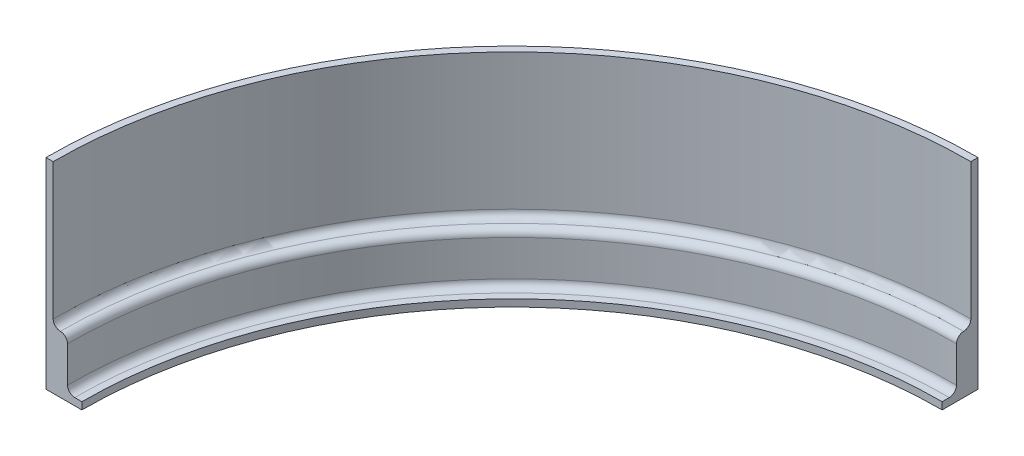
ISO-10303-21;
HEADER;
FILE_DESCRIPTION(('STEP AP214'),'2;1');
FILE_NAME('part.step','',(''),(''),'','','');
FILE_SCHEMA(('AUTOMOTIVE_DESIGN { 1 0 10303 214 1 1 1 1 }'));
ENDSEC;
DATA;
#1=APPLICATION_CONTEXT('core data for automotive mechanical design processes');
#2=APPLICATION_PROTOCOL_DEFINITION('international standard','automotive_design',2000,#1);
#3=PRODUCT_CONTEXT('',#1,'mechanical');
#4=PRODUCT('Part','Part','',(#3));
#5=PRODUCT_RELATED_PRODUCT_CATEGORY('part','',(#4));
#6=PRODUCT_DEFINITION_FORMATION('','',#4);
#7=PRODUCT_DEFINITION_CONTEXT('part definition',#1,'design');
#8=PRODUCT_DEFINITION('design','',#6,#7);
#9=PRODUCT_DEFINITION_SHAPE('','',#8);
#10=(LENGTH_UNIT() NAMED_UNIT(*) SI_UNIT(.MILLI.,.METRE.));
#11=(NAMED_UNIT(*) PLANE_ANGLE_UNIT() SI_UNIT($,.RADIAN.));
#12=(NAMED_UNIT(*) SI_UNIT($,.STERADIAN.) SOLID_ANGLE_UNIT());
#13=UNCERTAINTY_MEASURE_WITH_UNIT(LENGTH_MEASURE(1.E-05),#10,'distance_accuracy_value','');
#14=(GEOMETRIC_REPRESENTATION_CONTEXT(3) GLOBAL_UNCERTAINTY_ASSIGNED_CONTEXT((#13)) GLOBAL_UNIT_ASSIGNED_CONTEXT((#10,
#11,#12)) REPRESENTATION_CONTEXT('',''));
#15=CARTESIAN_POINT('',(0.,0.,0.));
#16=DIRECTION('',(0.,0.,1.));
#17=DIRECTION('',(1.,0.,0.));
#18=AXIS2_PLACEMENT_3D('',#15,#16,#17);
#19=CARTESIAN_POINT('',(300.,5.,0.));
#20=DIRECTION('',(0.,-1.,0.));
#21=DIRECTION('',(0.,0.,-1.));
#22=AXIS2_PLACEMENT_3D('',#19,#20,#21);
#23=PLANE('',#22);
#24=DIRECTION('',(0.,0.,-1.));
#25=VECTOR('',#24,1.);
#26=CARTESIAN_POINT('',(300.,5.,-300.));
#27=LINE('',#26,#25);
#28=CARTESIAN_POINT('',(300.,5.,-300.));
#29=VERTEX_POINT('',#28);
#30=CARTESIAN_POINT('',(300.,5.,-305.));
#31=VERTEX_POINT('',#30);
#32=EDGE_CURVE('E150',#29,#31,#27,.T.);
#33=ORIENTED_EDGE('',*,*,#32,.T.);
#34=CARTESIAN_POINT('',(300.,5.,0.));
#35=DIRECTION('',(0.,-1.,0.));
#36=DIRECTION('',(0.,0.,-1.));
#37=AXIS2_PLACEMENT_3D('',#34,#35,#36);
#38=CIRCLE('',#37,305.);
#39=CARTESIAN_POINT('',(-5.,5.,0.));
#40=VERTEX_POINT('',#39);
#41=EDGE_CURVE('E174',#31,#40,#38,.F.);
#42=ORIENTED_EDGE('',*,*,#41,.T.);
#43=DIRECTION('',(1.,0.,0.));
#44=VECTOR('',#43,1.);
#45=CARTESIAN_POINT('',(-25.,5.,0.));
#46=LINE('',#45,#44);
#47=CARTESIAN_POINT('',(0.,5.,0.));
#48=VERTEX_POINT('',#47);
#49=EDGE_CURVE('E154',#40,#48,#46,.T.);
#50=ORIENTED_EDGE('',*,*,#49,.T.);
#51=CARTESIAN_POINT('',(300.,5.,0.));
#52=DIRECTION('',(0.,-1.,0.));
#53=DIRECTION('',(0.,0.,-1.));
#54=AXIS2_PLACEMENT_3D('',#51,#52,#53);
#55=CIRCLE('',#54,300.);
#56=EDGE_CURVE('E147',#48,#29,#55,.T.);
#57=ORIENTED_EDGE('',*,*,#56,.T.);
#58=EDGE_LOOP('',(#33,#42,#50,#57));
#59=FACE_BOUND('',#58,.T.);
#60=ADVANCED_FACE('F33',(#59),#23,.F.);
#61=CARTESIAN_POINT('',(300.,5.,0.));
#62=DIRECTION('',(0.,-1.,0.));
#63=DIRECTION('',(0.,0.,-1.));
#64=AXIS2_PLACEMENT_3D('',#61,#62,#63);
#65=CYLINDRICAL_SURFACE('',#64,300.);
#66=CARTESIAN_POINT('',(300.,0.,0.));
#67=DIRECTION('',(0.,-1.,0.));
#68=DIRECTION('',(0.,0.,-1.));
#69=AXIS2_PLACEMENT_3D('',#66,#67,#68);
#70=CIRCLE('',#69,300.);
#71=CARTESIAN_POINT('',(0.,0.,0.));
#72=VERTEX_POINT('',#71);
#73=CARTESIAN_POINT('',(300.,0.,-300.));
#74=VERTEX_POINT('',#73);
#75=EDGE_CURVE('E146',#72,#74,#70,.T.);
#76=ORIENTED_EDGE('',*,*,#75,.T.);
#77=DIRECTION('',(0.,-1.,0.));
#78=VECTOR('',#77,1.);
#79=CARTESIAN_POINT('',(300.,5.,-300.));
#80=LINE('',#79,#78);
#81=EDGE_CURVE('E165',#29,#74,#80,.T.);
#82=ORIENTED_EDGE('',*,*,#81,.F.);
#83=ORIENTED_EDGE('',*,*,#56,.F.);
#84=DIRECTION('',(0.,-1.,0.));
#85=VECTOR('',#84,1.);
#86=CARTESIAN_POINT('',(0.,5.,0.));
#87=LINE('',#86,#85);
#88=EDGE_CURVE('E118',#48,#72,#87,.T.);
#89=ORIENTED_EDGE('',*,*,#88,.T.);
#90=EDGE_LOOP('',(#76,#82,#83,#89));
#91=FACE_BOUND('',#90,.T.);
#92=ADVANCED_FACE('F210',(#91),#65,.F.);
#93=CARTESIAN_POINT('',(300.,5.,-300.));
#94=DIRECTION('',(-1.,0.,0.));
#95=DIRECTION('',(0.,0.,1.));
#96=AXIS2_PLACEMENT_3D('',#93,#94,#95);
#97=PLANE('',#96);
#98=DIRECTION('',(0.,-1.,0.));
#99=VECTOR('',#98,1.);
#100=CARTESIAN_POINT('',(300.,140.,-320.));
#101=LINE('',#100,#99);
#102=CARTESIAN_POINT('',(300.,140.,-320.));
#103=VERTEX_POINT('',#102);
#104=CARTESIAN_POINT('',(300.,45.,-320.));
#105=VERTEX_POINT('',#104);
#106=EDGE_CURVE('E136',#103,#105,#101,.T.);
#107=ORIENTED_EDGE('',*,*,#106,.T.);
#108=CARTESIAN_POINT('',(300.,45.,-315.));
#109=DIRECTION('',(-1.,0.,0.));
#110=DIRECTION('',(0.,0.,1.));
#111=AXIS2_PLACEMENT_3D('',#108,#109,#110);
#112=CIRCLE('',#111,5.);
#113=CARTESIAN_POINT('',(300.,40.,-315.));
#114=VERTEX_POINT('',#113);
#115=EDGE_CURVE('E42',#105,#114,#112,.T.);
#116=ORIENTED_EDGE('',*,*,#115,.T.);
#117=CARTESIAN_POINT('',(300.,35.,-315.));
#118=DIRECTION('',(-1.,0.,0.));
#119=DIRECTION('',(0.,0.,1.));
#120=AXIS2_PLACEMENT_3D('',#117,#118,#119);
#121=CIRCLE('',#120,5.);
#122=CARTESIAN_POINT('',(300.,35.,-310.));
#123=VERTEX_POINT('',#122);
#124=EDGE_CURVE('E176',#114,#123,#121,.F.);
#125=ORIENTED_EDGE('',*,*,#124,.T.);
#126=DIRECTION('',(0.,-1.,0.));
#127=VECTOR('',#126,1.);
#128=CARTESIAN_POINT('',(300.,40.,-310.));
#129=LINE('',#128,#127);
#130=CARTESIAN_POINT('',(300.,10.,-310.));
#131=VERTEX_POINT('',#130);
#132=EDGE_CURVE('E140',#123,#131,#129,.T.);
#133=ORIENTED_EDGE('',*,*,#132,.T.);
#134=CARTESIAN_POINT('',(300.,10.,-305.));
#135=DIRECTION('',(-1.,0.,0.));
#136=DIRECTION('',(0.,0.,1.));
#137=AXIS2_PLACEMENT_3D('',#134,#135,#136);
#138=CIRCLE('',#137,5.);
#139=EDGE_CURVE('E181',#131,#31,#138,.T.);
#140=ORIENTED_EDGE('',*,*,#139,.T.);
#141=ORIENTED_EDGE('',*,*,#32,.F.);
#142=ORIENTED_EDGE('',*,*,#81,.T.);
#143=DIRECTION('',(0.,0.,-1.));
#144=VECTOR('',#143,1.);
#145=CARTESIAN_POINT('',(300.,0.,-300.));
#146=LINE('',#145,#144);
#147=CARTESIAN_POINT('',(300.,0.,-325.));
#148=VERTEX_POINT('',#147);
#149=EDGE_CURVE('E158',#74,#148,#146,.T.);
#150=ORIENTED_EDGE('',*,*,#149,.T.);
#151=DIRECTION('',(0.,-1.,0.));
#152=VECTOR('',#151,1.);
#153=CARTESIAN_POINT('',(300.,5.,-325.));
#154=LINE('',#153,#152);
#155=CARTESIAN_POINT('',(300.,140.,-325.));
#156=VERTEX_POINT('',#155);
#157=EDGE_CURVE('E117',#156,#148,#154,.T.);
#158=ORIENTED_EDGE('',*,*,#157,.F.);
#159=DIRECTION('',(0.,0.,-1.));
#160=VECTOR('',#159,1.);
#161=CARTESIAN_POINT('',(300.,140.,-325.));
#162=LINE('',#161,#160);
#163=EDGE_CURVE('E130',#103,#156,#162,.T.);
#164=ORIENTED_EDGE('',*,*,#163,.F.);
#165=EDGE_LOOP('',(#107,#116,#125,#133,#140,#141,#142,#150,#158,#164));
#166=FACE_BOUND('',#165,.T.);
#167=ADVANCED_FACE('F188',(#166),#97,.F.);
#168=CARTESIAN_POINT('',(300.,5.,0.));
#169=DIRECTION('',(0.,-1.,0.));
#170=DIRECTION('',(0.,0.,-1.));
#171=AXIS2_PLACEMENT_3D('',#168,#169,#170);
#172=CYLINDRICAL_SURFACE('',#171,325.);
#173=CARTESIAN_POINT('',(300.,0.,0.));
#174=DIRECTION('',(0.,1.,0.));
#175=DIRECTION('',(0.,0.,1.));
#176=AXIS2_PLACEMENT_3D('',#173,#174,#175);
#177=CIRCLE('',#176,325.);
#178=CARTESIAN_POINT('',(-25.,0.,0.));
#179=VERTEX_POINT('',#178);
#180=EDGE_CURVE('E115',#148,#179,#177,.T.);
#181=ORIENTED_EDGE('',*,*,#180,.T.);
#182=DIRECTION('',(0.,-1.,0.));
#183=VECTOR('',#182,1.);
#184=CARTESIAN_POINT('',(-25.,5.,0.));
#185=LINE('',#184,#183);
#186=CARTESIAN_POINT('',(-25.,140.,0.));
#187=VERTEX_POINT('',#186);
#188=EDGE_CURVE('E108',#187,#179,#185,.T.);
#189=ORIENTED_EDGE('',*,*,#188,.F.);
#190=CARTESIAN_POINT('',(300.,140.,0.));
#191=DIRECTION('',(0.,1.,0.));
#192=DIRECTION('',(0.,0.,1.));
#193=AXIS2_PLACEMENT_3D('',#190,#191,#192);
#194=CIRCLE('',#193,325.);
#195=EDGE_CURVE('E113',#156,#187,#194,.T.);
#196=ORIENTED_EDGE('',*,*,#195,.F.);
#197=ORIENTED_EDGE('',*,*,#157,.T.);
#198=EDGE_LOOP('',(#181,#189,#196,#197));
#199=FACE_BOUND('',#198,.T.);
#200=ADVANCED_FACE('F110',(#199),#172,.T.);
#201=CARTESIAN_POINT('',(-25.,5.,0.));
#202=DIRECTION('',(0.,0.,-1.));
#203=DIRECTION('',(-1.,0.,0.));
#204=AXIS2_PLACEMENT_3D('',#201,#202,#203);
#205=PLANE('',#204);
#206=DIRECTION('',(0.,-1.,0.));
#207=VECTOR('',#206,1.);
#208=CARTESIAN_POINT('',(-10.,40.,0.));
#209=LINE('',#208,#207);
#210=CARTESIAN_POINT('',(-10.,35.,0.));
#211=VERTEX_POINT('',#210);
#212=CARTESIAN_POINT('',(-10.,10.,0.));
#213=VERTEX_POINT('',#212);
#214=EDGE_CURVE('E143',#211,#213,#209,.T.);
#215=ORIENTED_EDGE('',*,*,#214,.F.);
#216=CARTESIAN_POINT('',(-15.,35.,0.));
#217=DIRECTION('',(0.,0.,-1.));
#218=DIRECTION('',(-1.,0.,0.));
#219=AXIS2_PLACEMENT_3D('',#216,#217,#218);
#220=CIRCLE('',#219,5.);
#221=CARTESIAN_POINT('',(-15.,40.,0.));
#222=VERTEX_POINT('',#221);
#223=EDGE_CURVE('E52',#211,#222,#220,.F.);
#224=ORIENTED_EDGE('',*,*,#223,.T.);
#225=CARTESIAN_POINT('',(-15.,45.,0.));
#226=DIRECTION('',(0.,0.,-1.));
#227=DIRECTION('',(-1.,0.,0.));
#228=AXIS2_PLACEMENT_3D('',#225,#226,#227);
#229=CIRCLE('',#228,5.);
#230=CARTESIAN_POINT('',(-20.,45.,0.));
#231=VERTEX_POINT('',#230);
#232=EDGE_CURVE('E11',#222,#231,#229,.T.);
#233=ORIENTED_EDGE('',*,*,#232,.T.);
#234=DIRECTION('',(0.,-1.,0.));
#235=VECTOR('',#234,1.);
#236=CARTESIAN_POINT('',(-20.,140.,0.));
#237=LINE('',#236,#235);
#238=CARTESIAN_POINT('',(-20.,140.,0.));
#239=VERTEX_POINT('',#238);
#240=EDGE_CURVE('E122',#239,#231,#237,.T.);
#241=ORIENTED_EDGE('',*,*,#240,.F.);
#242=DIRECTION('',(1.,0.,0.));
#243=VECTOR('',#242,1.);
#244=CARTESIAN_POINT('',(-25.,140.,0.));
#245=LINE('',#244,#243);
#246=EDGE_CURVE('E120',#187,#239,#245,.T.);
#247=ORIENTED_EDGE('',*,*,#246,.F.);
#248=ORIENTED_EDGE('',*,*,#188,.T.);
#249=DIRECTION('',(1.,0.,0.));
#250=VECTOR('',#249,1.);
#251=CARTESIAN_POINT('',(-25.,0.,0.));
#252=LINE('',#251,#250);
#253=EDGE_CURVE('E151',#179,#72,#252,.T.);
#254=ORIENTED_EDGE('',*,*,#253,.T.);
#255=ORIENTED_EDGE('',*,*,#88,.F.);
#256=ORIENTED_EDGE('',*,*,#49,.F.);
#257=CARTESIAN_POINT('',(-5.,10.,0.));
#258=DIRECTION('',(0.,0.,-1.));
#259=DIRECTION('',(-1.,0.,0.));
#260=AXIS2_PLACEMENT_3D('',#257,#258,#259);
#261=CIRCLE('',#260,5.);
#262=EDGE_CURVE('E183',#40,#213,#261,.T.);
#263=ORIENTED_EDGE('',*,*,#262,.T.);
#264=EDGE_LOOP('',(#215,#224,#233,#241,#247,#248,#254,#255,#256,#263));
#265=FACE_BOUND('',#264,.T.);
#266=ADVANCED_FACE('F121',(#265),#205,.F.);
#267=CARTESIAN_POINT('',(300.,0.,0.));
#268=DIRECTION('',(0.,-1.,0.));
#269=DIRECTION('',(0.,0.,-1.));
#270=AXIS2_PLACEMENT_3D('',#267,#268,#269);
#271=PLANE('',#270);
#272=ORIENTED_EDGE('',*,*,#75,.F.);
#273=ORIENTED_EDGE('',*,*,#253,.F.);
#274=ORIENTED_EDGE('',*,*,#180,.F.);
#275=ORIENTED_EDGE('',*,*,#149,.F.);
#276=EDGE_LOOP('',(#272,#273,#274,#275));
#277=FACE_BOUND('',#276,.T.);
#278=ADVANCED_FACE('F213',(#277),#271,.T.);
#279=CARTESIAN_POINT('',(300.,40.,0.));
#280=DIRECTION('',(0.,-1.,0.));
#281=DIRECTION('',(0.,0.,-1.));
#282=AXIS2_PLACEMENT_3D('',#279,#280,#281);
#283=CYLINDRICAL_SURFACE('',#282,310.);
#284=ORIENTED_EDGE('',*,*,#214,.T.);
#285=CARTESIAN_POINT('',(300.,10.,0.));
#286=DIRECTION('',(0.,-1.,0.));
#287=DIRECTION('',(0.,0.,-1.));
#288=AXIS2_PLACEMENT_3D('',#285,#286,#287);
#289=CIRCLE('',#288,310.);
#290=EDGE_CURVE('E171',#213,#131,#289,.T.);
#291=ORIENTED_EDGE('',*,*,#290,.T.);
#292=ORIENTED_EDGE('',*,*,#132,.F.);
#293=CARTESIAN_POINT('',(300.,35.,0.));
#294=DIRECTION('',(0.,1.,0.));
#295=DIRECTION('',(0.,0.,1.));
#296=AXIS2_PLACEMENT_3D('',#293,#294,#295);
#297=CIRCLE('',#296,310.);
#298=EDGE_CURVE('E168',#123,#211,#297,.T.);
#299=ORIENTED_EDGE('',*,*,#298,.T.);
#300=EDGE_LOOP('',(#284,#291,#292,#299));
#301=FACE_BOUND('',#300,.T.);
#302=ADVANCED_FACE('F198',(#301),#283,.F.);
#303=CARTESIAN_POINT('',(300.,140.,0.));
#304=DIRECTION('',(0.,-1.,0.));
#305=DIRECTION('',(0.,0.,-1.));
#306=AXIS2_PLACEMENT_3D('',#303,#304,#305);
#307=CYLINDRICAL_SURFACE('',#306,320.);
#308=ORIENTED_EDGE('',*,*,#240,.T.);
#309=CARTESIAN_POINT('',(300.,45.,0.));
#310=DIRECTION('',(0.,1.,0.));
#311=DIRECTION('',(0.,0.,1.));
#312=AXIS2_PLACEMENT_3D('',#309,#310,#311);
#313=CIRCLE('',#312,320.);
#314=EDGE_CURVE('E179',#231,#105,#313,.F.);
#315=ORIENTED_EDGE('',*,*,#314,.T.);
#316=ORIENTED_EDGE('',*,*,#106,.F.);
#317=CARTESIAN_POINT('',(300.,140.,0.));
#318=DIRECTION('',(0.,-1.,0.));
#319=DIRECTION('',(0.,0.,1.));
#320=AXIS2_PLACEMENT_3D('',#317,#318,#319);
#321=CIRCLE('',#320,320.);
#322=EDGE_CURVE('E125',#239,#103,#321,.T.);
#323=ORIENTED_EDGE('',*,*,#322,.F.);
#324=EDGE_LOOP('',(#308,#315,#316,#323));
#325=FACE_BOUND('',#324,.T.);
#326=ADVANCED_FACE('F220',(#325),#307,.F.);
#327=CARTESIAN_POINT('',(300.,140.,0.));
#328=DIRECTION('',(0.,1.,0.));
#329=DIRECTION('',(0.,0.,1.));
#330=AXIS2_PLACEMENT_3D('',#327,#328,#329);
#331=PLANE('',#330);
#332=ORIENTED_EDGE('',*,*,#195,.T.);
#333=ORIENTED_EDGE('',*,*,#246,.T.);
#334=ORIENTED_EDGE('',*,*,#322,.T.);
#335=ORIENTED_EDGE('',*,*,#163,.T.);
#336=EDGE_LOOP('',(#332,#333,#334,#335));
#337=FACE_BOUND('',#336,.T.);
#338=ADVANCED_FACE('F128',(#337),#331,.T.);
#339=CARTESIAN_POINT('',(300.,10.,0.));
#340=DIRECTION('',(0.,-1.,0.));
#341=DIRECTION('',(0.,0.,-1.));
#342=AXIS2_PLACEMENT_3D('',#339,#340,#341);
#343=TOROIDAL_SURFACE('',#342,305.,5.);
#344=ORIENTED_EDGE('',*,*,#262,.F.);
#345=ORIENTED_EDGE('',*,*,#41,.F.);
#346=ORIENTED_EDGE('',*,*,#139,.F.);
#347=ORIENTED_EDGE('',*,*,#290,.F.);
#348=EDGE_LOOP('',(#344,#345,#346,#347));
#349=FACE_BOUND('',#348,.T.);
#350=ADVANCED_FACE('F205',(#349),#343,.F.);
#351=CARTESIAN_POINT('',(300.,45.,0.));
#352=DIRECTION('',(0.,1.,0.));
#353=DIRECTION('',(0.,0.,1.));
#354=AXIS2_PLACEMENT_3D('',#351,#352,#353);
#355=TOROIDAL_SURFACE('',#354,315.,5.);
#356=ORIENTED_EDGE('',*,*,#314,.F.);
#357=ORIENTED_EDGE('',*,*,#232,.F.);
#358=CARTESIAN_POINT('',(300.,40.,0.));
#359=DIRECTION('',(0.,1.,0.));
#360=DIRECTION('',(0.,0.,1.));
#361=AXIS2_PLACEMENT_3D('',#358,#359,#360);
#362=CIRCLE('',#361,315.);
#363=EDGE_CURVE('E37',#114,#222,#362,.T.);
#364=ORIENTED_EDGE('',*,*,#363,.F.);
#365=ORIENTED_EDGE('',*,*,#115,.F.);
#366=EDGE_LOOP('',(#356,#357,#364,#365));
#367=FACE_BOUND('',#366,.T.);
#368=ADVANCED_FACE('F35',(#367),#355,.F.);
#369=CARTESIAN_POINT('',(300.,35.,0.));
#370=DIRECTION('',(0.,1.,0.));
#371=DIRECTION('',(0.,0.,1.));
#372=AXIS2_PLACEMENT_3D('',#369,#370,#371);
#373=TOROIDAL_SURFACE('',#372,315.,5.);
#374=ORIENTED_EDGE('',*,*,#223,.F.);
#375=ORIENTED_EDGE('',*,*,#298,.F.);
#376=ORIENTED_EDGE('',*,*,#124,.F.);
#377=ORIENTED_EDGE('',*,*,#363,.T.);
#378=EDGE_LOOP('',(#374,#375,#376,#377));
#379=FACE_BOUND('',#378,.T.);
#380=ADVANCED_FACE('F196',(#379),#373,.T.);
#381=CLOSED_SHELL('',(#60,#92,#167,#200,#266,#278,#302,#326,#338,#350,#368,#380));
#382=MANIFOLD_SOLID_BREP('B2',#381);
#383=ADVANCED_BREP_SHAPE_REPRESENTATION('',(#18,#382),#14);
#384=SHAPE_DEFINITION_REPRESENTATION(#9,#383);
ENDSEC;
END-ISO-10303-21;
